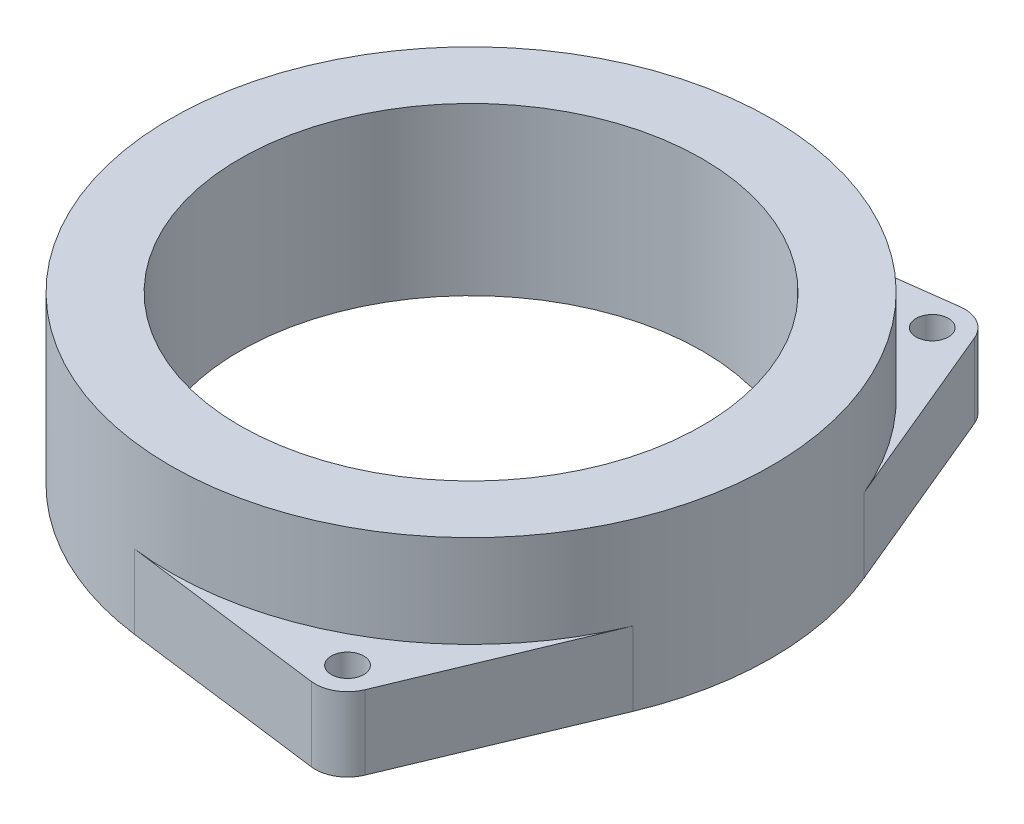
ISO-10303-21;
HEADER;
FILE_DESCRIPTION(('STEP AP214'),'2;1');
FILE_NAME('part.step','',(''),(''),'','','');
FILE_SCHEMA(('AUTOMOTIVE_DESIGN { 1 0 10303 214 1 1 1 1 }'));
ENDSEC;
DATA;
#1=APPLICATION_CONTEXT('core data for automotive mechanical design processes');
#2=APPLICATION_PROTOCOL_DEFINITION('international standard','automotive_design',2000,#1);
#3=PRODUCT_CONTEXT('',#1,'mechanical');
#4=PRODUCT('Part','Part','',(#3));
#5=PRODUCT_RELATED_PRODUCT_CATEGORY('part','',(#4));
#6=PRODUCT_DEFINITION_FORMATION('','',#4);
#7=PRODUCT_DEFINITION_CONTEXT('part definition',#1,'design');
#8=PRODUCT_DEFINITION('design','',#6,#7);
#9=PRODUCT_DEFINITION_SHAPE('','',#8);
#10=(LENGTH_UNIT() NAMED_UNIT(*) SI_UNIT(.MILLI.,.METRE.));
#11=(NAMED_UNIT(*) PLANE_ANGLE_UNIT() SI_UNIT($,.RADIAN.));
#12=(NAMED_UNIT(*) SI_UNIT($,.STERADIAN.) SOLID_ANGLE_UNIT());
#13=UNCERTAINTY_MEASURE_WITH_UNIT(LENGTH_MEASURE(1.E-05),#10,'distance_accuracy_value','');
#14=(GEOMETRIC_REPRESENTATION_CONTEXT(3) GLOBAL_UNCERTAINTY_ASSIGNED_CONTEXT((#13)) GLOBAL_UNIT_ASSIGNED_CONTEXT((#10,
#11,#12)) REPRESENTATION_CONTEXT('',''));
#15=CARTESIAN_POINT('',(0.,0.,0.));
#16=DIRECTION('',(0.,0.,1.));
#17=DIRECTION('',(1.,0.,0.));
#18=AXIS2_PLACEMENT_3D('',#15,#16,#17);
#19=CARTESIAN_POINT('',(-36.5,8.,0.));
#20=DIRECTION('',(0.,1.,0.));
#21=DIRECTION('',(0.,0.,1.));
#22=AXIS2_PLACEMENT_3D('',#19,#20,#21);
#23=PLANE('',#22);
#24=CARTESIAN_POINT('',(0.,8.,0.));
#25=DIRECTION('',(0.,1.,0.));
#26=DIRECTION('',(0.,0.,1.));
#27=AXIS2_PLACEMENT_3D('',#24,#25,#26);
#28=CIRCLE('',#27,32.5);
#29=CARTESIAN_POINT('',(30.0021531435178,8.,-12.4948312014571));
#30=VERTEX_POINT('',#29);
#31=CARTESIAN_POINT('',(-4.18023533529862,8.,-32.2300423912461));
#32=VERTEX_POINT('',#31);
#33=EDGE_CURVE('E11',#30,#32,#28,.T.);
#34=ORIENTED_EDGE('',*,*,#33,.F.);
#35=DIRECTION('',(-0.384456344660219,0.,-0.923143173646701));
#36=VECTOR('',#35,1.);
#37=CARTESIAN_POINT('',(21.4810011077635,8.,-32.9555244444427));
#38=LINE('',#37,#36);
#39=CARTESIAN_POINT('',(21.4810011077635,8.,-32.9555244444427));
#40=VERTEX_POINT('',#39);
#41=EDGE_CURVE('E171',#30,#40,#38,.T.);
#42=ORIENTED_EDGE('',*,*,#41,.T.);
#43=CARTESIAN_POINT('',(18.2500000000002,8.,-31.6099272381319));
#44=DIRECTION('',(0.,1.,0.));
#45=DIRECTION('',(0.,0.,1.));
#46=AXIS2_PLACEMENT_3D('',#43,#44,#45);
#47=CIRCLE('',#46,3.5);
#48=CARTESIAN_POINT('',(17.7998208100449,8.,-35.0808548802661));
#49=VERTEX_POINT('',#48);
#50=EDGE_CURVE('E145',#40,#49,#47,.T.);
#51=ORIENTED_EDGE('',*,*,#50,.T.);
#52=DIRECTION('',(-0.991693612038342,0.,0.128622625701496));
#53=VECTOR('',#52,1.);
#54=CARTESIAN_POINT('',(17.7998208100449,8.,-35.0808548802662));
#55=LINE('',#54,#53);
#56=EDGE_CURVE('E140',#49,#32,#55,.T.);
#57=ORIENTED_EDGE('',*,*,#56,.T.);
#58=EDGE_LOOP('',(#34,#42,#51,#57));
#59=FACE_BOUND('',#58,.T.);
#60=CARTESIAN_POINT('',(18.2500000000002,8.,-31.6099272381319));
#61=DIRECTION('',(0.,1.,0.));
#62=DIRECTION('',(0.,0.,1.));
#63=AXIS2_PLACEMENT_3D('',#60,#61,#62);
#64=CIRCLE('',#63,1.75);
#65=CARTESIAN_POINT('',(18.2500000000002,8.,-29.8599272381319));
#66=VERTEX_POINT('',#65);
#67=EDGE_CURVE('E244',#66,#66,#64,.T.);
#68=ORIENTED_EDGE('',*,*,#67,.F.);
#69=EDGE_LOOP('',(#68));
#70=FACE_BOUND('',#69,.T.);
#71=ADVANCED_FACE('F39',(#59,#70),#23,.T.);
#72=CARTESIAN_POINT('',(-25.8219178082192,8.,-19.735211189789));
#73=VERTEX_POINT('',#72);
#74=CARTESIAN_POINT('',(-25.8219178082192,8.,19.735211189789));
#75=VERTEX_POINT('',#74);
#76=EDGE_CURVE('E49',#73,#75,#28,.T.);
#77=ORIENTED_EDGE('',*,*,#76,.F.);
#78=DIRECTION('',(-0.607237267378124,0.,0.794520547945205));
#79=VECTOR('',#78,1.);
#80=CARTESIAN_POINT('',(-39.2808219178082,8.,-2.12533043582344));
#81=LINE('',#80,#79);
#82=CARTESIAN_POINT('',(-39.2808219178082,8.,-2.12533043582344));
#83=VERTEX_POINT('',#82);
#84=EDGE_CURVE('E59',#73,#83,#81,.T.);
#85=ORIENTED_EDGE('',*,*,#84,.T.);
#86=CARTESIAN_POINT('',(-36.5,8.,0.));
#87=DIRECTION('',(0.,1.,0.));
#88=DIRECTION('',(0.,0.,1.));
#89=AXIS2_PLACEMENT_3D('',#86,#87,#88);
#90=CIRCLE('',#89,3.50000000000001);
#91=CARTESIAN_POINT('',(-39.2808219178082,8.,2.12533043582343));
#92=VERTEX_POINT('',#91);
#93=EDGE_CURVE('E206',#83,#92,#90,.T.);
#94=ORIENTED_EDGE('',*,*,#93,.T.);
#95=DIRECTION('',(0.607237267378123,0.,0.794520547945205));
#96=VECTOR('',#95,1.);
#97=CARTESIAN_POINT('',(-39.2808219178082,8.,2.12533043582343));
#98=LINE('',#97,#96);
#99=EDGE_CURVE('E116',#92,#75,#98,.T.);
#100=ORIENTED_EDGE('',*,*,#99,.T.);
#101=EDGE_LOOP('',(#77,#85,#94,#100));
#102=FACE_BOUND('',#101,.T.);
#103=CARTESIAN_POINT('',(-36.5,8.,0.));
#104=DIRECTION('',(0.,1.,0.));
#105=DIRECTION('',(0.,0.,1.));
#106=AXIS2_PLACEMENT_3D('',#103,#104,#105);
#107=CIRCLE('',#106,1.75);
#108=CARTESIAN_POINT('',(-36.5,8.,1.75));
#109=VERTEX_POINT('',#108);
#110=EDGE_CURVE('E238',#109,#109,#107,.T.);
#111=ORIENTED_EDGE('',*,*,#110,.F.);
#112=EDGE_LOOP('',(#111));
#113=FACE_BOUND('',#112,.T.);
#114=ADVANCED_FACE('F279',(#102,#113),#23,.T.);
#115=CARTESIAN_POINT('',(-4.1802353352986,8.,32.2300423912461));
#116=VERTEX_POINT('',#115);
#117=CARTESIAN_POINT('',(30.0021531435178,8.,12.4948312014571));
#118=VERTEX_POINT('',#117);
#119=EDGE_CURVE('E51',#116,#118,#28,.T.);
#120=ORIENTED_EDGE('',*,*,#119,.F.);
#121=DIRECTION('',(0.991693612038342,0.,0.128622625701495));
#122=VECTOR('',#121,1.);
#123=CARTESIAN_POINT('',(17.7998208100445,8.,35.0808548802662));
#124=LINE('',#123,#122);
#125=CARTESIAN_POINT('',(17.7998208100445,8.,35.0808548802662));
#126=VERTEX_POINT('',#125);
#127=EDGE_CURVE('E253',#116,#126,#124,.T.);
#128=ORIENTED_EDGE('',*,*,#127,.T.);
#129=CARTESIAN_POINT('',(18.2499999999997,8.,31.6099272381322));
#130=DIRECTION('',(0.,1.,0.));
#131=DIRECTION('',(0.,0.,1.));
#132=AXIS2_PLACEMENT_3D('',#129,#130,#131);
#133=CIRCLE('',#132,3.5);
#134=CARTESIAN_POINT('',(21.4810011077632,8.,32.955524444443));
#135=VERTEX_POINT('',#134);
#136=EDGE_CURVE('E178',#126,#135,#133,.T.);
#137=ORIENTED_EDGE('',*,*,#136,.T.);
#138=DIRECTION('',(0.384456344660217,0.,-0.923143173646702));
#139=VECTOR('',#138,1.);
#140=CARTESIAN_POINT('',(21.4810011077634,8.,32.955524444443));
#141=LINE('',#140,#139);
#142=EDGE_CURVE('E174',#135,#118,#141,.T.);
#143=ORIENTED_EDGE('',*,*,#142,.T.);
#144=EDGE_LOOP('',(#120,#128,#137,#143));
#145=FACE_BOUND('',#144,.T.);
#146=CARTESIAN_POINT('',(18.2499999999997,8.,31.6099272381322));
#147=DIRECTION('',(0.,1.,0.));
#148=DIRECTION('',(0.,0.,1.));
#149=AXIS2_PLACEMENT_3D('',#146,#147,#148);
#150=CIRCLE('',#149,1.75);
#151=CARTESIAN_POINT('',(18.2499999999997,8.,33.3599272381322));
#152=VERTEX_POINT('',#151);
#153=EDGE_CURVE('E231',#152,#152,#150,.T.);
#154=ORIENTED_EDGE('',*,*,#153,.F.);
#155=EDGE_LOOP('',(#154));
#156=FACE_BOUND('',#155,.T.);
#157=ADVANCED_FACE('F257',(#145,#156),#23,.T.);
#158=CARTESIAN_POINT('',(-36.5,0.,0.));
#159=DIRECTION('',(0.,1.,0.));
#160=DIRECTION('',(0.,0.,1.));
#161=AXIS2_PLACEMENT_3D('',#158,#159,#160);
#162=PLANE('',#161);
#163=CARTESIAN_POINT('',(-36.5,0.,0.));
#164=DIRECTION('',(0.,1.,0.));
#165=DIRECTION('',(0.,0.,1.));
#166=AXIS2_PLACEMENT_3D('',#163,#164,#165);
#167=CIRCLE('',#166,3.50000000000001);
#168=CARTESIAN_POINT('',(-39.2808219178082,0.,-2.12533043582344));
#169=VERTEX_POINT('',#168);
#170=CARTESIAN_POINT('',(-39.2808219178082,0.,2.12533043582343));
#171=VERTEX_POINT('',#170);
#172=EDGE_CURVE('E184',#169,#171,#167,.T.);
#173=ORIENTED_EDGE('',*,*,#172,.F.);
#174=DIRECTION('',(-0.607237267378124,0.,0.794520547945205));
#175=VECTOR('',#174,1.);
#176=CARTESIAN_POINT('',(-39.2808219178082,0.,-2.12533043582344));
#177=LINE('',#176,#175);
#178=CARTESIAN_POINT('',(-25.8219178082192,0.,-19.735211189789));
#179=VERTEX_POINT('',#178);
#180=EDGE_CURVE('E107',#179,#169,#177,.T.);
#181=ORIENTED_EDGE('',*,*,#180,.F.);
#182=CARTESIAN_POINT('',(0.,0.,0.));
#183=DIRECTION('',(0.,1.,0.));
#184=DIRECTION('',(0.,0.,1.));
#185=AXIS2_PLACEMENT_3D('',#182,#183,#184);
#186=CIRCLE('',#185,32.5);
#187=CARTESIAN_POINT('',(-4.18023533529862,0.,-32.2300423912461));
#188=VERTEX_POINT('',#187);
#189=EDGE_CURVE('E101',#188,#179,#186,.T.);
#190=ORIENTED_EDGE('',*,*,#189,.F.);
#191=DIRECTION('',(-0.991693612038342,0.,0.128622625701496));
#192=VECTOR('',#191,1.);
#193=CARTESIAN_POINT('',(17.7998208100449,0.,-35.0808548802662));
#194=LINE('',#193,#192);
#195=CARTESIAN_POINT('',(17.7998208100449,0.,-35.0808548802661));
#196=VERTEX_POINT('',#195);
#197=EDGE_CURVE('E153',#196,#188,#194,.T.);
#198=ORIENTED_EDGE('',*,*,#197,.F.);
#199=CARTESIAN_POINT('',(18.2500000000002,0.,-31.6099272381319));
#200=DIRECTION('',(0.,1.,0.));
#201=DIRECTION('',(0.,0.,1.));
#202=AXIS2_PLACEMENT_3D('',#199,#200,#201);
#203=CIRCLE('',#202,3.5);
#204=CARTESIAN_POINT('',(21.4810011077635,0.,-32.9555244444427));
#205=VERTEX_POINT('',#204);
#206=EDGE_CURVE('E201',#205,#196,#203,.T.);
#207=ORIENTED_EDGE('',*,*,#206,.F.);
#208=DIRECTION('',(-0.384456344660219,0.,-0.923143173646701));
#209=VECTOR('',#208,1.);
#210=CARTESIAN_POINT('',(21.4810011077635,0.,-32.9555244444427));
#211=LINE('',#210,#209);
#212=CARTESIAN_POINT('',(30.0021531435178,0.,-12.4948312014571));
#213=VERTEX_POINT('',#212);
#214=EDGE_CURVE('E199',#213,#205,#211,.T.);
#215=ORIENTED_EDGE('',*,*,#214,.F.);
#216=CARTESIAN_POINT('',(0.,0.,0.));
#217=DIRECTION('',(0.,1.,0.));
#218=DIRECTION('',(0.,0.,1.));
#219=AXIS2_PLACEMENT_3D('',#216,#217,#218);
#220=CIRCLE('',#219,32.5);
#221=CARTESIAN_POINT('',(30.0021531435178,0.,12.4948312014571));
#222=VERTEX_POINT('',#221);
#223=EDGE_CURVE('E164',#222,#213,#220,.T.);
#224=ORIENTED_EDGE('',*,*,#223,.F.);
#225=DIRECTION('',(0.384456344660217,0.,-0.923143173646702));
#226=VECTOR('',#225,1.);
#227=CARTESIAN_POINT('',(21.4810011077634,0.,32.955524444443));
#228=LINE('',#227,#226);
#229=CARTESIAN_POINT('',(21.4810011077632,0.,32.955524444443));
#230=VERTEX_POINT('',#229);
#231=EDGE_CURVE('E196',#230,#222,#228,.T.);
#232=ORIENTED_EDGE('',*,*,#231,.F.);
#233=CARTESIAN_POINT('',(18.2499999999997,0.,31.6099272381322));
#234=DIRECTION('',(0.,1.,0.));
#235=DIRECTION('',(0.,0.,1.));
#236=AXIS2_PLACEMENT_3D('',#233,#234,#235);
#237=CIRCLE('',#236,3.5);
#238=CARTESIAN_POINT('',(17.7998208100445,0.,35.0808548802662));
#239=VERTEX_POINT('',#238);
#240=EDGE_CURVE('E194',#239,#230,#237,.T.);
#241=ORIENTED_EDGE('',*,*,#240,.F.);
#242=DIRECTION('',(0.991693612038342,0.,0.128622625701495));
#243=VECTOR('',#242,1.);
#244=CARTESIAN_POINT('',(17.7998208100445,0.,35.0808548802662));
#245=LINE('',#244,#243);
#246=CARTESIAN_POINT('',(-4.1802353352986,0.,32.2300423912461));
#247=VERTEX_POINT('',#246);
#248=EDGE_CURVE('E192',#247,#239,#245,.T.);
#249=ORIENTED_EDGE('',*,*,#248,.F.);
#250=CARTESIAN_POINT('',(0.,0.,0.));
#251=DIRECTION('',(0.,1.,0.));
#252=DIRECTION('',(0.,0.,1.));
#253=AXIS2_PLACEMENT_3D('',#250,#251,#252);
#254=CIRCLE('',#253,32.5);
#255=CARTESIAN_POINT('',(-25.8219178082192,0.,19.735211189789));
#256=VERTEX_POINT('',#255);
#257=EDGE_CURVE('E190',#256,#247,#254,.T.);
#258=ORIENTED_EDGE('',*,*,#257,.F.);
#259=DIRECTION('',(0.607237267378123,0.,0.794520547945205));
#260=VECTOR('',#259,1.);
#261=CARTESIAN_POINT('',(-39.2808219178082,0.,2.12533043582343));
#262=LINE('',#261,#260);
#263=EDGE_CURVE('E187',#171,#256,#262,.T.);
#264=ORIENTED_EDGE('',*,*,#263,.F.);
#265=EDGE_LOOP('',(#173,#181,#190,#198,#207,#215,#224,#232,#241,#249,#258,#264));
#266=FACE_BOUND('',#265,.T.);
#267=CARTESIAN_POINT('',(0.,0.,0.));
#268=DIRECTION('',(0.,1.,0.));
#269=DIRECTION('',(0.,0.,1.));
#270=AXIS2_PLACEMENT_3D('',#267,#268,#269);
#271=CIRCLE('',#270,25.);
#272=CARTESIAN_POINT('',(0.,0.,25.));
#273=VERTEX_POINT('',#272);
#274=EDGE_CURVE('E188',#273,#273,#271,.T.);
#275=ORIENTED_EDGE('',*,*,#274,.T.);
#276=EDGE_LOOP('',(#275));
#277=FACE_BOUND('',#276,.T.);
#278=CARTESIAN_POINT('',(18.2500000000002,0.,-31.6099272381319));
#279=DIRECTION('',(0.,1.,0.));
#280=DIRECTION('',(0.,0.,1.));
#281=AXIS2_PLACEMENT_3D('',#278,#279,#280);
#282=CIRCLE('',#281,1.75);
#283=CARTESIAN_POINT('',(18.2500000000002,0.,-29.8599272381319));
#284=VERTEX_POINT('',#283);
#285=EDGE_CURVE('E241',#284,#284,#282,.T.);
#286=ORIENTED_EDGE('',*,*,#285,.T.);
#287=EDGE_LOOP('',(#286));
#288=FACE_BOUND('',#287,.T.);
#289=CARTESIAN_POINT('',(-36.5,0.,0.));
#290=DIRECTION('',(0.,1.,0.));
#291=DIRECTION('',(0.,0.,1.));
#292=AXIS2_PLACEMENT_3D('',#289,#290,#291);
#293=CIRCLE('',#292,1.75);
#294=CARTESIAN_POINT('',(-36.5,0.,1.75));
#295=VERTEX_POINT('',#294);
#296=EDGE_CURVE('E234',#295,#295,#293,.T.);
#297=ORIENTED_EDGE('',*,*,#296,.T.);
#298=EDGE_LOOP('',(#297));
#299=FACE_BOUND('',#298,.T.);
#300=CARTESIAN_POINT('',(18.2499999999997,0.,31.6099272381322));
#301=DIRECTION('',(0.,1.,0.));
#302=DIRECTION('',(0.,0.,1.));
#303=AXIS2_PLACEMENT_3D('',#300,#301,#302);
#304=CIRCLE('',#303,1.75);
#305=CARTESIAN_POINT('',(18.2499999999997,0.,33.3599272381322));
#306=VERTEX_POINT('',#305);
#307=EDGE_CURVE('E235',#306,#306,#304,.T.);
#308=ORIENTED_EDGE('',*,*,#307,.T.);
#309=EDGE_LOOP('',(#308));
#310=FACE_BOUND('',#309,.T.);
#311=ADVANCED_FACE('F271',(#266,#277,#288,#299,#310),#162,.F.);
#312=CARTESIAN_POINT('',(-36.5,8.,0.));
#313=DIRECTION('',(0.,-1.,0.));
#314=DIRECTION('',(0.,0.,-1.));
#315=AXIS2_PLACEMENT_3D('',#312,#313,#314);
#316=CYLINDRICAL_SURFACE('',#315,3.50000000000001);
#317=ORIENTED_EDGE('',*,*,#172,.T.);
#318=DIRECTION('',(0.,-1.,0.));
#319=VECTOR('',#318,1.);
#320=CARTESIAN_POINT('',(-39.2808219178082,8.,2.12533043582343));
#321=LINE('',#320,#319);
#322=EDGE_CURVE('E43',#92,#171,#321,.T.);
#323=ORIENTED_EDGE('',*,*,#322,.F.);
#324=ORIENTED_EDGE('',*,*,#93,.F.);
#325=DIRECTION('',(0.,-1.,0.));
#326=VECTOR('',#325,1.);
#327=CARTESIAN_POINT('',(-39.2808219178082,8.,-2.12533043582344));
#328=LINE('',#327,#326);
#329=EDGE_CURVE('E183',#83,#169,#328,.T.);
#330=ORIENTED_EDGE('',*,*,#329,.T.);
#331=EDGE_LOOP('',(#317,#323,#324,#330));
#332=FACE_BOUND('',#331,.T.);
#333=ADVANCED_FACE('F41',(#332),#316,.T.);
#334=CARTESIAN_POINT('',(-39.2808219178082,8.,2.12533043582343));
#335=DIRECTION('',(0.794520547945205,0.,-0.607237267378123));
#336=DIRECTION('',(-0.607237267378123,0.,-0.794520547945206));
#337=AXIS2_PLACEMENT_3D('',#334,#335,#336);
#338=PLANE('',#337);
#339=ORIENTED_EDGE('',*,*,#263,.T.);
#340=DIRECTION('',(0.,-1.,0.));
#341=VECTOR('',#340,1.);
#342=CARTESIAN_POINT('',(-25.8219178082192,8.,19.735211189789));
#343=LINE('',#342,#341);
#344=EDGE_CURVE('E220',#75,#256,#343,.T.);
#345=ORIENTED_EDGE('',*,*,#344,.F.);
#346=ORIENTED_EDGE('',*,*,#99,.F.);
#347=ORIENTED_EDGE('',*,*,#322,.T.);
#348=EDGE_LOOP('',(#339,#345,#346,#347));
#349=FACE_BOUND('',#348,.T.);
#350=ADVANCED_FACE('F281',(#349),#338,.F.);
#351=CARTESIAN_POINT('',(17.7998208100445,8.,35.0808548802662));
#352=DIRECTION('',(0.128622625701495,0.,-0.991693612038342));
#353=DIRECTION('',(-0.991693612038342,0.,-0.128622625701495));
#354=AXIS2_PLACEMENT_3D('',#351,#352,#353);
#355=PLANE('',#354);
#356=ORIENTED_EDGE('',*,*,#248,.T.);
#357=DIRECTION('',(0.,-1.,0.));
#358=VECTOR('',#357,1.);
#359=CARTESIAN_POINT('',(17.7998208100445,8.,35.0808548802662));
#360=LINE('',#359,#358);
#361=EDGE_CURVE('E215',#126,#239,#360,.T.);
#362=ORIENTED_EDGE('',*,*,#361,.F.);
#363=ORIENTED_EDGE('',*,*,#127,.F.);
#364=DIRECTION('',(0.,-1.,0.));
#365=VECTOR('',#364,1.);
#366=CARTESIAN_POINT('',(-4.1802353352986,8.,32.2300423912461));
#367=LINE('',#366,#365);
#368=EDGE_CURVE('E218',#116,#247,#367,.T.);
#369=ORIENTED_EDGE('',*,*,#368,.T.);
#370=EDGE_LOOP('',(#356,#362,#363,#369));
#371=FACE_BOUND('',#370,.T.);
#372=ADVANCED_FACE('F283',(#371),#355,.F.);
#373=CARTESIAN_POINT('',(18.2499999999997,8.,31.6099272381322));
#374=DIRECTION('',(0.,-1.,0.));
#375=DIRECTION('',(0.,0.,-1.));
#376=AXIS2_PLACEMENT_3D('',#373,#374,#375);
#377=CYLINDRICAL_SURFACE('',#376,3.5);
#378=ORIENTED_EDGE('',*,*,#240,.T.);
#379=DIRECTION('',(0.,-1.,0.));
#380=VECTOR('',#379,1.);
#381=CARTESIAN_POINT('',(21.4810011077632,8.,32.955524444443));
#382=LINE('',#381,#380);
#383=EDGE_CURVE('E212',#135,#230,#382,.T.);
#384=ORIENTED_EDGE('',*,*,#383,.F.);
#385=ORIENTED_EDGE('',*,*,#136,.F.);
#386=ORIENTED_EDGE('',*,*,#361,.T.);
#387=EDGE_LOOP('',(#378,#384,#385,#386));
#388=FACE_BOUND('',#387,.T.);
#389=ADVANCED_FACE('F263',(#388),#377,.T.);
#390=CARTESIAN_POINT('',(21.4810011077634,8.,32.955524444443));
#391=DIRECTION('',(-0.923143173646702,0.,-0.384456344660217));
#392=DIRECTION('',(-0.384456344660217,0.,0.923143173646702));
#393=AXIS2_PLACEMENT_3D('',#390,#391,#392);
#394=PLANE('',#393);
#395=ORIENTED_EDGE('',*,*,#231,.T.);
#396=DIRECTION('',(0.,-1.,0.));
#397=VECTOR('',#396,1.);
#398=CARTESIAN_POINT('',(30.0021531435178,8.,12.4948312014571));
#399=LINE('',#398,#397);
#400=EDGE_CURVE('E167',#118,#222,#399,.T.);
#401=ORIENTED_EDGE('',*,*,#400,.F.);
#402=ORIENTED_EDGE('',*,*,#142,.F.);
#403=ORIENTED_EDGE('',*,*,#383,.T.);
#404=EDGE_LOOP('',(#395,#401,#402,#403));
#405=FACE_BOUND('',#404,.T.);
#406=ADVANCED_FACE('F268',(#405),#394,.F.);
#407=CARTESIAN_POINT('',(21.4810011077635,8.,-32.9555244444427));
#408=DIRECTION('',(-0.923143173646701,0.,0.384456344660219));
#409=DIRECTION('',(0.384456344660219,0.,0.923143173646701));
#410=AXIS2_PLACEMENT_3D('',#407,#408,#409);
#411=PLANE('',#410);
#412=ORIENTED_EDGE('',*,*,#214,.T.);
#413=DIRECTION('',(0.,-1.,0.));
#414=VECTOR('',#413,1.);
#415=CARTESIAN_POINT('',(21.4810011077635,8.,-32.9555244444427));
#416=LINE('',#415,#414);
#417=EDGE_CURVE('E168',#40,#205,#416,.T.);
#418=ORIENTED_EDGE('',*,*,#417,.F.);
#419=ORIENTED_EDGE('',*,*,#41,.F.);
#420=DIRECTION('',(0.,-1.,0.));
#421=VECTOR('',#420,1.);
#422=CARTESIAN_POINT('',(30.0021531435178,8.,-12.4948312014571));
#423=LINE('',#422,#421);
#424=EDGE_CURVE('E160',#30,#213,#423,.T.);
#425=ORIENTED_EDGE('',*,*,#424,.T.);
#426=EDGE_LOOP('',(#412,#418,#419,#425));
#427=FACE_BOUND('',#426,.T.);
#428=ADVANCED_FACE('F172',(#427),#411,.F.);
#429=CARTESIAN_POINT('',(18.2500000000002,8.,-31.6099272381319));
#430=DIRECTION('',(0.,-1.,0.));
#431=DIRECTION('',(0.,0.,-1.));
#432=AXIS2_PLACEMENT_3D('',#429,#430,#431);
#433=CYLINDRICAL_SURFACE('',#432,3.5);
#434=ORIENTED_EDGE('',*,*,#206,.T.);
#435=DIRECTION('',(0.,-1.,0.));
#436=VECTOR('',#435,1.);
#437=CARTESIAN_POINT('',(17.7998208100449,8.,-35.0808548802661));
#438=LINE('',#437,#436);
#439=EDGE_CURVE('E154',#49,#196,#438,.T.);
#440=ORIENTED_EDGE('',*,*,#439,.F.);
#441=ORIENTED_EDGE('',*,*,#50,.F.);
#442=ORIENTED_EDGE('',*,*,#417,.T.);
#443=EDGE_LOOP('',(#434,#440,#441,#442));
#444=FACE_BOUND('',#443,.T.);
#445=ADVANCED_FACE('F275',(#444),#433,.T.);
#446=CARTESIAN_POINT('',(17.7998208100449,8.,-35.0808548802662));
#447=DIRECTION('',(0.128622625701496,0.,0.991693612038342));
#448=DIRECTION('',(0.991693612038342,0.,-0.128622625701496));
#449=AXIS2_PLACEMENT_3D('',#446,#447,#448);
#450=PLANE('',#449);
#451=ORIENTED_EDGE('',*,*,#197,.T.);
#452=DIRECTION('',(0.,-1.,0.));
#453=VECTOR('',#452,1.);
#454=CARTESIAN_POINT('',(-4.18023533529862,8.,-32.2300423912461));
#455=LINE('',#454,#453);
#456=EDGE_CURVE('E150',#32,#188,#455,.T.);
#457=ORIENTED_EDGE('',*,*,#456,.F.);
#458=ORIENTED_EDGE('',*,*,#56,.F.);
#459=ORIENTED_EDGE('',*,*,#439,.T.);
#460=EDGE_LOOP('',(#451,#457,#458,#459));
#461=FACE_BOUND('',#460,.T.);
#462=ADVANCED_FACE('F151',(#461),#450,.F.);
#463=CARTESIAN_POINT('',(0.,8.,0.));
#464=DIRECTION('',(0.,-1.,0.));
#465=DIRECTION('',(0.,0.,-1.));
#466=AXIS2_PLACEMENT_3D('',#463,#464,#465);
#467=CYLINDRICAL_SURFACE('',#466,32.5);
#468=ORIENTED_EDGE('',*,*,#189,.T.);
#469=DIRECTION('',(0.,-1.,0.));
#470=VECTOR('',#469,1.);
#471=CARTESIAN_POINT('',(-25.8219178082192,8.,-19.735211189789));
#472=LINE('',#471,#470);
#473=EDGE_CURVE('E155',#73,#179,#472,.T.);
#474=ORIENTED_EDGE('',*,*,#473,.F.);
#475=ORIENTED_EDGE('',*,*,#76,.T.);
#476=ORIENTED_EDGE('',*,*,#344,.T.);
#477=ORIENTED_EDGE('',*,*,#257,.T.);
#478=ORIENTED_EDGE('',*,*,#368,.F.);
#479=ORIENTED_EDGE('',*,*,#119,.T.);
#480=ORIENTED_EDGE('',*,*,#400,.T.);
#481=ORIENTED_EDGE('',*,*,#223,.T.);
#482=ORIENTED_EDGE('',*,*,#424,.F.);
#483=ORIENTED_EDGE('',*,*,#33,.T.);
#484=ORIENTED_EDGE('',*,*,#456,.T.);
#485=EDGE_LOOP('',(#468,#474,#475,#476,#477,#478,#479,#480,#481,#482,#483,#484));
#486=FACE_BOUND('',#485,.T.);
#487=CARTESIAN_POINT('',(0.,18.,0.));
#488=DIRECTION('',(0.,1.,0.));
#489=DIRECTION('',(0.,0.,1.));
#490=AXIS2_PLACEMENT_3D('',#487,#488,#489);
#491=CIRCLE('',#490,32.5);
#492=CARTESIAN_POINT('',(0.,18.,32.5));
#493=VERTEX_POINT('',#492);
#494=EDGE_CURVE('E229',#493,#493,#491,.T.);
#495=ORIENTED_EDGE('',*,*,#494,.F.);
#496=EDGE_LOOP('',(#495));
#497=FACE_BOUND('',#496,.T.);
#498=ADVANCED_FACE('F157',(#486,#497),#467,.T.);
#499=CARTESIAN_POINT('',(-39.2808219178082,8.,-2.12533043582344));
#500=DIRECTION('',(0.794520547945205,0.,0.607237267378124));
#501=DIRECTION('',(0.607237267378124,0.,-0.794520547945205));
#502=AXIS2_PLACEMENT_3D('',#499,#500,#501);
#503=PLANE('',#502);
#504=ORIENTED_EDGE('',*,*,#180,.T.);
#505=ORIENTED_EDGE('',*,*,#329,.F.);
#506=ORIENTED_EDGE('',*,*,#84,.F.);
#507=ORIENTED_EDGE('',*,*,#473,.T.);
#508=EDGE_LOOP('',(#504,#505,#506,#507));
#509=FACE_BOUND('',#508,.T.);
#510=ADVANCED_FACE('F278',(#509),#503,.F.);
#511=CARTESIAN_POINT('',(0.,8.,0.));
#512=DIRECTION('',(0.,-1.,0.));
#513=DIRECTION('',(0.,0.,-1.));
#514=AXIS2_PLACEMENT_3D('',#511,#512,#513);
#515=CYLINDRICAL_SURFACE('',#514,25.);
#516=ORIENTED_EDGE('',*,*,#274,.F.);
#517=EDGE_LOOP('',(#516));
#518=FACE_BOUND('',#517,.T.);
#519=CARTESIAN_POINT('',(0.,18.,0.));
#520=DIRECTION('',(0.,1.,0.));
#521=DIRECTION('',(0.,0.,1.));
#522=AXIS2_PLACEMENT_3D('',#519,#520,#521);
#523=CIRCLE('',#522,25.);
#524=CARTESIAN_POINT('',(0.,18.,25.));
#525=VERTEX_POINT('',#524);
#526=EDGE_CURVE('E415',#525,#525,#523,.T.);
#527=ORIENTED_EDGE('',*,*,#526,.T.);
#528=EDGE_LOOP('',(#527));
#529=FACE_BOUND('',#528,.T.);
#530=ADVANCED_FACE('F307',(#518,#529),#515,.F.);
#531=CARTESIAN_POINT('',(18.2500000000002,8.,-31.6099272381319));
#532=DIRECTION('',(0.,-1.,0.));
#533=DIRECTION('',(0.,0.,-1.));
#534=AXIS2_PLACEMENT_3D('',#531,#532,#533);
#535=CYLINDRICAL_SURFACE('',#534,1.75);
#536=ORIENTED_EDGE('',*,*,#67,.T.);
#537=EDGE_LOOP('',(#536));
#538=FACE_BOUND('',#537,.T.);
#539=ORIENTED_EDGE('',*,*,#285,.F.);
#540=EDGE_LOOP('',(#539));
#541=FACE_BOUND('',#540,.T.);
#542=ADVANCED_FACE('F340',(#538,#541),#535,.F.);
#543=CARTESIAN_POINT('',(-36.5,8.,0.));
#544=DIRECTION('',(0.,-1.,0.));
#545=DIRECTION('',(0.,0.,-1.));
#546=AXIS2_PLACEMENT_3D('',#543,#544,#545);
#547=CYLINDRICAL_SURFACE('',#546,1.75);
#548=ORIENTED_EDGE('',*,*,#110,.T.);
#549=EDGE_LOOP('',(#548));
#550=FACE_BOUND('',#549,.T.);
#551=ORIENTED_EDGE('',*,*,#296,.F.);
#552=EDGE_LOOP('',(#551));
#553=FACE_BOUND('',#552,.T.);
#554=ADVANCED_FACE('F344',(#550,#553),#547,.F.);
#555=CARTESIAN_POINT('',(18.2499999999997,8.,31.6099272381322));
#556=DIRECTION('',(0.,-1.,0.));
#557=DIRECTION('',(0.,0.,-1.));
#558=AXIS2_PLACEMENT_3D('',#555,#556,#557);
#559=CYLINDRICAL_SURFACE('',#558,1.75);
#560=ORIENTED_EDGE('',*,*,#153,.T.);
#561=EDGE_LOOP('',(#560));
#562=FACE_BOUND('',#561,.T.);
#563=ORIENTED_EDGE('',*,*,#307,.F.);
#564=EDGE_LOOP('',(#563));
#565=FACE_BOUND('',#564,.T.);
#566=ADVANCED_FACE('F353',(#562,#565),#559,.F.);
#567=CARTESIAN_POINT('',(0.,18.,0.));
#568=DIRECTION('',(0.,1.,0.));
#569=DIRECTION('',(0.,0.,1.));
#570=AXIS2_PLACEMENT_3D('',#567,#568,#569);
#571=PLANE('',#570);
#572=ORIENTED_EDGE('',*,*,#494,.T.);
#573=EDGE_LOOP('',(#572));
#574=FACE_BOUND('',#573,.T.);
#575=ORIENTED_EDGE('',*,*,#526,.F.);
#576=EDGE_LOOP('',(#575));
#577=FACE_BOUND('',#576,.T.);
#578=ADVANCED_FACE('F361',(#574,#577),#571,.T.);
#579=CLOSED_SHELL('',(#71,#114,#157,#311,#333,#350,#372,#389,#406,#428,#445,#462,#498,#510,#530,
#542,#554,#566,#578));
#580=MANIFOLD_SOLID_BREP('B2',#579);
#581=ADVANCED_BREP_SHAPE_REPRESENTATION('',(#18,#580),#14);
#582=SHAPE_DEFINITION_REPRESENTATION(#9,#581);
ENDSEC;
END-ISO-10303-21;
